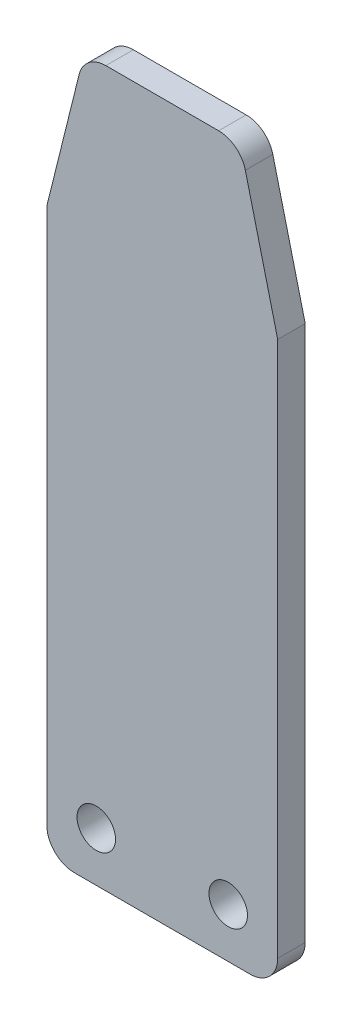
ISO-10303-21;
HEADER;
FILE_DESCRIPTION(('STEP AP214'),'2;1');
FILE_NAME('part.step','',(''),(''),'','','');
FILE_SCHEMA(('AUTOMOTIVE_DESIGN { 1 0 10303 214 1 1 1 1 }'));
ENDSEC;
DATA;
#1=APPLICATION_CONTEXT('core data for automotive mechanical design processes');
#2=APPLICATION_PROTOCOL_DEFINITION('international standard','automotive_design',2000,#1);
#3=PRODUCT_CONTEXT('',#1,'mechanical');
#4=PRODUCT('Part','Part','',(#3));
#5=PRODUCT_RELATED_PRODUCT_CATEGORY('part','',(#4));
#6=PRODUCT_DEFINITION_FORMATION('','',#4);
#7=PRODUCT_DEFINITION_CONTEXT('part definition',#1,'design');
#8=PRODUCT_DEFINITION('design','',#6,#7);
#9=PRODUCT_DEFINITION_SHAPE('','',#8);
#10=(LENGTH_UNIT() NAMED_UNIT(*) SI_UNIT(.MILLI.,.METRE.));
#11=(NAMED_UNIT(*) PLANE_ANGLE_UNIT() SI_UNIT($,.RADIAN.));
#12=(NAMED_UNIT(*) SI_UNIT($,.STERADIAN.) SOLID_ANGLE_UNIT());
#13=UNCERTAINTY_MEASURE_WITH_UNIT(LENGTH_MEASURE(1.E-05),#10,'distance_accuracy_value','');
#14=(GEOMETRIC_REPRESENTATION_CONTEXT(3) GLOBAL_UNCERTAINTY_ASSIGNED_CONTEXT((#13)) GLOBAL_UNIT_ASSIGNED_CONTEXT((#10,
#11,#12)) REPRESENTATION_CONTEXT('',''));
#15=CARTESIAN_POINT('',(0.,0.,0.));
#16=DIRECTION('',(0.,0.,1.));
#17=DIRECTION('',(1.,0.,0.));
#18=AXIS2_PLACEMENT_3D('',#15,#16,#17);
#19=CARTESIAN_POINT('',(32.,10.,10.));
#20=DIRECTION('',(0.,0.,-1.));
#21=DIRECTION('',(-1.,0.,0.));
#22=AXIS2_PLACEMENT_3D('',#19,#20,#21);
#23=PLANE('',#22);
#24=DIRECTION('',(0.,1.,0.));
#25=VECTOR('',#24,1.);
#26=CARTESIAN_POINT('',(42.,205.,10.));
#27=LINE('',#26,#25);
#28=CARTESIAN_POINT('',(42.,10.,10.));
#29=VERTEX_POINT('',#28);
#30=CARTESIAN_POINT('',(42.,205.,10.));
#31=VERTEX_POINT('',#30);
#32=EDGE_CURVE('E188',#29,#31,#27,.T.);
#33=ORIENTED_EDGE('',*,*,#32,.T.);
#34=DIRECTION('',(-0.241081408406981,0.970504896700942,0.));
#35=VECTOR('',#34,1.);
#36=CARTESIAN_POINT('',(30.2227633554835,252.41081408407,10.));
#37=LINE('',#36,#35);
#38=CARTESIAN_POINT('',(30.2227633554835,252.41081408407,10.));
#39=VERTEX_POINT('',#38);
#40=EDGE_CURVE('E112',#31,#39,#37,.T.);
#41=ORIENTED_EDGE('',*,*,#40,.T.);
#42=CARTESIAN_POINT('',(20.5177143884741,250.,10.));
#43=DIRECTION('',(0.,0.,1.));
#44=DIRECTION('',(-1.,0.,0.));
#45=AXIS2_PLACEMENT_3D('',#42,#43,#44);
#46=CIRCLE('',#45,9.99999999999998);
#47=CARTESIAN_POINT('',(20.517714388474,260.,10.));
#48=VERTEX_POINT('',#47);
#49=EDGE_CURVE('E217',#39,#48,#46,.T.);
#50=ORIENTED_EDGE('',*,*,#49,.T.);
#51=DIRECTION('',(-1.,0.,0.));
#52=VECTOR('',#51,1.);
#53=CARTESIAN_POINT('',(-20.517714388474,260.,10.));
#54=LINE('',#53,#52);
#55=CARTESIAN_POINT('',(-20.517714388474,260.,10.));
#56=VERTEX_POINT('',#55);
#57=EDGE_CURVE('E237',#48,#56,#54,.T.);
#58=ORIENTED_EDGE('',*,*,#57,.T.);
#59=CARTESIAN_POINT('',(-20.5177143884741,250.,10.));
#60=DIRECTION('',(0.,0.,1.));
#61=DIRECTION('',(1.,0.,0.));
#62=AXIS2_PLACEMENT_3D('',#59,#60,#61);
#63=CIRCLE('',#62,9.99999999999998);
#64=CARTESIAN_POINT('',(-30.2227633554835,252.41081408407,10.));
#65=VERTEX_POINT('',#64);
#66=EDGE_CURVE('E233',#56,#65,#63,.T.);
#67=ORIENTED_EDGE('',*,*,#66,.T.);
#68=DIRECTION('',(-0.241081408406981,-0.970504896700942,0.));
#69=VECTOR('',#68,1.);
#70=CARTESIAN_POINT('',(-30.2227633554835,252.41081408407,10.));
#71=LINE('',#70,#69);
#72=CARTESIAN_POINT('',(-42.,205.,10.));
#73=VERTEX_POINT('',#72);
#74=EDGE_CURVE('E236',#65,#73,#71,.T.);
#75=ORIENTED_EDGE('',*,*,#74,.T.);
#76=DIRECTION('',(0.,-1.,0.));
#77=VECTOR('',#76,1.);
#78=CARTESIAN_POINT('',(-42.,205.,10.));
#79=LINE('',#78,#77);
#80=CARTESIAN_POINT('',(-42.,10.,10.));
#81=VERTEX_POINT('',#80);
#82=EDGE_CURVE('E137',#73,#81,#79,.T.);
#83=ORIENTED_EDGE('',*,*,#82,.T.);
#84=CARTESIAN_POINT('',(-32.,10.,10.));
#85=DIRECTION('',(0.,0.,1.));
#86=DIRECTION('',(1.,0.,0.));
#87=AXIS2_PLACEMENT_3D('',#84,#85,#86);
#88=CIRCLE('',#87,10.);
#89=CARTESIAN_POINT('',(-32.,0.,10.));
#90=VERTEX_POINT('',#89);
#91=EDGE_CURVE('E131',#81,#90,#88,.T.);
#92=ORIENTED_EDGE('',*,*,#91,.T.);
#93=DIRECTION('',(1.,0.,0.));
#94=VECTOR('',#93,1.);
#95=CARTESIAN_POINT('',(32.,0.,10.));
#96=LINE('',#95,#94);
#97=CARTESIAN_POINT('',(32.,0.,10.));
#98=VERTEX_POINT('',#97);
#99=EDGE_CURVE('E135',#90,#98,#96,.T.);
#100=ORIENTED_EDGE('',*,*,#99,.T.);
#101=CARTESIAN_POINT('',(32.,10.,10.));
#102=DIRECTION('',(0.,0.,1.));
#103=DIRECTION('',(-1.,0.,0.));
#104=AXIS2_PLACEMENT_3D('',#101,#102,#103);
#105=CIRCLE('',#104,10.);
#106=EDGE_CURVE('E63',#98,#29,#105,.T.);
#107=ORIENTED_EDGE('',*,*,#106,.T.);
#108=EDGE_LOOP('',(#33,#41,#50,#58,#67,#75,#83,#92,#100,#107));
#109=FACE_BOUND('',#108,.T.);
#110=CARTESIAN_POINT('',(24.,18.,10.));
#111=DIRECTION('',(0.,0.,1.));
#112=DIRECTION('',(1.,0.,0.));
#113=AXIS2_PLACEMENT_3D('',#110,#111,#112);
#114=CIRCLE('',#113,7.);
#115=CARTESIAN_POINT('',(31.,18.,10.));
#116=VERTEX_POINT('',#115);
#117=EDGE_CURVE('E164',#116,#116,#114,.T.);
#118=ORIENTED_EDGE('',*,*,#117,.F.);
#119=EDGE_LOOP('',(#118));
#120=FACE_BOUND('',#119,.T.);
#121=CARTESIAN_POINT('',(-24.,18.,10.));
#122=DIRECTION('',(0.,0.,1.));
#123=DIRECTION('',(-1.,0.,0.));
#124=AXIS2_PLACEMENT_3D('',#121,#122,#123);
#125=CIRCLE('',#124,7.);
#126=CARTESIAN_POINT('',(-31.,18.,10.));
#127=VERTEX_POINT('',#126);
#128=EDGE_CURVE('E255',#127,#127,#125,.T.);
#129=ORIENTED_EDGE('',*,*,#128,.F.);
#130=EDGE_LOOP('',(#129));
#131=FACE_BOUND('',#130,.T.);
#132=ADVANCED_FACE('F45',(#109,#120,#131),#23,.F.);
#133=CARTESIAN_POINT('',(32.,10.,0.));
#134=DIRECTION('',(0.,0.,-1.));
#135=DIRECTION('',(-1.,0.,0.));
#136=AXIS2_PLACEMENT_3D('',#133,#134,#135);
#137=PLANE('',#136);
#138=CARTESIAN_POINT('',(24.,18.,0.));
#139=DIRECTION('',(0.,0.,1.));
#140=DIRECTION('',(1.,0.,0.));
#141=AXIS2_PLACEMENT_3D('',#138,#139,#140);
#142=CIRCLE('',#141,7.);
#143=CARTESIAN_POINT('',(31.,18.,0.));
#144=VERTEX_POINT('',#143);
#145=EDGE_CURVE('E251',#144,#144,#142,.T.);
#146=ORIENTED_EDGE('',*,*,#145,.T.);
#147=EDGE_LOOP('',(#146));
#148=FACE_BOUND('',#147,.T.);
#149=DIRECTION('',(0.,1.,0.));
#150=VECTOR('',#149,1.);
#151=CARTESIAN_POINT('',(42.,205.,0.));
#152=LINE('',#151,#150);
#153=CARTESIAN_POINT('',(42.,10.,0.));
#154=VERTEX_POINT('',#153);
#155=CARTESIAN_POINT('',(42.,205.,0.));
#156=VERTEX_POINT('',#155);
#157=EDGE_CURVE('E159',#154,#156,#152,.T.);
#158=ORIENTED_EDGE('',*,*,#157,.F.);
#159=CARTESIAN_POINT('',(32.,10.,0.));
#160=DIRECTION('',(0.,0.,1.));
#161=DIRECTION('',(-1.,0.,0.));
#162=AXIS2_PLACEMENT_3D('',#159,#160,#161);
#163=CIRCLE('',#162,10.);
#164=CARTESIAN_POINT('',(32.,0.,0.));
#165=VERTEX_POINT('',#164);
#166=EDGE_CURVE('E104',#165,#154,#163,.T.);
#167=ORIENTED_EDGE('',*,*,#166,.F.);
#168=DIRECTION('',(1.,0.,0.));
#169=VECTOR('',#168,1.);
#170=CARTESIAN_POINT('',(32.,0.,0.));
#171=LINE('',#170,#169);
#172=CARTESIAN_POINT('',(-32.,0.,0.));
#173=VERTEX_POINT('',#172);
#174=EDGE_CURVE('E98',#173,#165,#171,.T.);
#175=ORIENTED_EDGE('',*,*,#174,.F.);
#176=CARTESIAN_POINT('',(-32.,10.,0.));
#177=DIRECTION('',(0.,0.,1.));
#178=DIRECTION('',(1.,0.,0.));
#179=AXIS2_PLACEMENT_3D('',#176,#177,#178);
#180=CIRCLE('',#179,10.);
#181=CARTESIAN_POINT('',(-42.,10.,0.));
#182=VERTEX_POINT('',#181);
#183=EDGE_CURVE('E146',#182,#173,#180,.T.);
#184=ORIENTED_EDGE('',*,*,#183,.F.);
#185=DIRECTION('',(0.,-1.,0.));
#186=VECTOR('',#185,1.);
#187=CARTESIAN_POINT('',(-42.,205.,0.));
#188=LINE('',#187,#186);
#189=CARTESIAN_POINT('',(-42.,205.,0.));
#190=VERTEX_POINT('',#189);
#191=EDGE_CURVE('E179',#190,#182,#188,.T.);
#192=ORIENTED_EDGE('',*,*,#191,.F.);
#193=DIRECTION('',(-0.241081408406981,-0.970504896700942,0.));
#194=VECTOR('',#193,1.);
#195=CARTESIAN_POINT('',(-30.2227633554835,252.41081408407,0.));
#196=LINE('',#195,#194);
#197=CARTESIAN_POINT('',(-30.2227633554835,252.41081408407,0.));
#198=VERTEX_POINT('',#197);
#199=EDGE_CURVE('E176',#198,#190,#196,.T.);
#200=ORIENTED_EDGE('',*,*,#199,.F.);
#201=CARTESIAN_POINT('',(-20.5177143884741,250.,0.));
#202=DIRECTION('',(0.,0.,1.));
#203=DIRECTION('',(1.,0.,0.));
#204=AXIS2_PLACEMENT_3D('',#201,#202,#203);
#205=CIRCLE('',#204,9.99999999999998);
#206=CARTESIAN_POINT('',(-20.517714388474,260.,0.));
#207=VERTEX_POINT('',#206);
#208=EDGE_CURVE('E173',#207,#198,#205,.T.);
#209=ORIENTED_EDGE('',*,*,#208,.F.);
#210=DIRECTION('',(-1.,0.,0.));
#211=VECTOR('',#210,1.);
#212=CARTESIAN_POINT('',(-20.517714388474,260.,0.));
#213=LINE('',#212,#211);
#214=CARTESIAN_POINT('',(20.517714388474,260.,0.));
#215=VERTEX_POINT('',#214);
#216=EDGE_CURVE('E170',#215,#207,#213,.T.);
#217=ORIENTED_EDGE('',*,*,#216,.F.);
#218=CARTESIAN_POINT('',(20.5177143884741,250.,0.));
#219=DIRECTION('',(0.,0.,1.));
#220=DIRECTION('',(-1.,0.,0.));
#221=AXIS2_PLACEMENT_3D('',#218,#219,#220);
#222=CIRCLE('',#221,9.99999999999998);
#223=CARTESIAN_POINT('',(30.2227633554835,252.41081408407,0.));
#224=VERTEX_POINT('',#223);
#225=EDGE_CURVE('E167',#224,#215,#222,.T.);
#226=ORIENTED_EDGE('',*,*,#225,.F.);
#227=DIRECTION('',(-0.241081408406981,0.970504896700942,0.));
#228=VECTOR('',#227,1.);
#229=CARTESIAN_POINT('',(30.2227633554835,252.41081408407,0.));
#230=LINE('',#229,#228);
#231=EDGE_CURVE('E163',#156,#224,#230,.T.);
#232=ORIENTED_EDGE('',*,*,#231,.F.);
#233=EDGE_LOOP('',(#158,#167,#175,#184,#192,#200,#209,#217,#226,#232));
#234=FACE_BOUND('',#233,.T.);
#235=CARTESIAN_POINT('',(-24.,18.,0.));
#236=DIRECTION('',(0.,0.,1.));
#237=DIRECTION('',(-1.,0.,0.));
#238=AXIS2_PLACEMENT_3D('',#235,#236,#237);
#239=CIRCLE('',#238,7.);
#240=CARTESIAN_POINT('',(-31.,18.,0.));
#241=VERTEX_POINT('',#240);
#242=EDGE_CURVE('E259',#241,#241,#239,.T.);
#243=ORIENTED_EDGE('',*,*,#242,.T.);
#244=EDGE_LOOP('',(#243));
#245=FACE_BOUND('',#244,.T.);
#246=ADVANCED_FACE('F221',(#148,#234,#245),#137,.T.);
#247=CARTESIAN_POINT('',(42.,205.,10.));
#248=DIRECTION('',(-1.,0.,0.));
#249=DIRECTION('',(0.,-1.,0.));
#250=AXIS2_PLACEMENT_3D('',#247,#248,#249);
#251=PLANE('',#250);
#252=ORIENTED_EDGE('',*,*,#157,.T.);
#253=DIRECTION('',(0.,0.,-1.));
#254=VECTOR('',#253,1.);
#255=CARTESIAN_POINT('',(42.,205.,10.));
#256=LINE('',#255,#254);
#257=EDGE_CURVE('E11',#31,#156,#256,.T.);
#258=ORIENTED_EDGE('',*,*,#257,.F.);
#259=ORIENTED_EDGE('',*,*,#32,.F.);
#260=DIRECTION('',(0.,0.,-1.));
#261=VECTOR('',#260,1.);
#262=CARTESIAN_POINT('',(42.,10.,10.));
#263=LINE('',#262,#261);
#264=EDGE_CURVE('E155',#29,#154,#263,.T.);
#265=ORIENTED_EDGE('',*,*,#264,.T.);
#266=EDGE_LOOP('',(#252,#258,#259,#265));
#267=FACE_BOUND('',#266,.T.);
#268=ADVANCED_FACE('F47',(#267),#251,.F.);
#269=CARTESIAN_POINT('',(30.2227633554835,252.41081408407,10.));
#270=DIRECTION('',(-0.970504896700942,-0.241081408406981,0.));
#271=DIRECTION('',(0.241081408406981,-0.970504896700942,0.));
#272=AXIS2_PLACEMENT_3D('',#269,#270,#271);
#273=PLANE('',#272);
#274=ORIENTED_EDGE('',*,*,#231,.T.);
#275=DIRECTION('',(0.,0.,-1.));
#276=VECTOR('',#275,1.);
#277=CARTESIAN_POINT('',(30.2227633554835,252.41081408407,10.));
#278=LINE('',#277,#276);
#279=EDGE_CURVE('E55',#39,#224,#278,.T.);
#280=ORIENTED_EDGE('',*,*,#279,.F.);
#281=ORIENTED_EDGE('',*,*,#40,.F.);
#282=ORIENTED_EDGE('',*,*,#257,.T.);
#283=EDGE_LOOP('',(#274,#280,#281,#282));
#284=FACE_BOUND('',#283,.T.);
#285=ADVANCED_FACE('F301',(#284),#273,.F.);
#286=CARTESIAN_POINT('',(20.5177143884741,250.,10.));
#287=DIRECTION('',(0.,0.,-1.));
#288=DIRECTION('',(-1.,0.,0.));
#289=AXIS2_PLACEMENT_3D('',#286,#287,#288);
#290=CYLINDRICAL_SURFACE('',#289,9.99999999999998);
#291=ORIENTED_EDGE('',*,*,#225,.T.);
#292=DIRECTION('',(0.,0.,-1.));
#293=VECTOR('',#292,1.);
#294=CARTESIAN_POINT('',(20.517714388474,260.,10.));
#295=LINE('',#294,#293);
#296=EDGE_CURVE('E207',#48,#215,#295,.T.);
#297=ORIENTED_EDGE('',*,*,#296,.F.);
#298=ORIENTED_EDGE('',*,*,#49,.F.);
#299=ORIENTED_EDGE('',*,*,#279,.T.);
#300=EDGE_LOOP('',(#291,#297,#298,#299));
#301=FACE_BOUND('',#300,.T.);
#302=ADVANCED_FACE('F215',(#301),#290,.T.);
#303=CARTESIAN_POINT('',(-20.517714388474,260.,10.));
#304=DIRECTION('',(0.,-1.,0.));
#305=DIRECTION('',(0.,0.,-1.));
#306=AXIS2_PLACEMENT_3D('',#303,#304,#305);
#307=PLANE('',#306);
#308=ORIENTED_EDGE('',*,*,#216,.T.);
#309=DIRECTION('',(0.,0.,-1.));
#310=VECTOR('',#309,1.);
#311=CARTESIAN_POINT('',(-20.517714388474,260.,10.));
#312=LINE('',#311,#310);
#313=EDGE_CURVE('E203',#56,#207,#312,.T.);
#314=ORIENTED_EDGE('',*,*,#313,.F.);
#315=ORIENTED_EDGE('',*,*,#57,.F.);
#316=ORIENTED_EDGE('',*,*,#296,.T.);
#317=EDGE_LOOP('',(#308,#314,#315,#316));
#318=FACE_BOUND('',#317,.T.);
#319=ADVANCED_FACE('F227',(#318),#307,.F.);
#320=CARTESIAN_POINT('',(-20.5177143884741,250.,10.));
#321=DIRECTION('',(0.,0.,-1.));
#322=DIRECTION('',(-1.,0.,0.));
#323=AXIS2_PLACEMENT_3D('',#320,#321,#322);
#324=CYLINDRICAL_SURFACE('',#323,9.99999999999998);
#325=ORIENTED_EDGE('',*,*,#208,.T.);
#326=DIRECTION('',(0.,0.,-1.));
#327=VECTOR('',#326,1.);
#328=CARTESIAN_POINT('',(-30.2227633554835,252.41081408407,10.));
#329=LINE('',#328,#327);
#330=EDGE_CURVE('E199',#65,#198,#329,.T.);
#331=ORIENTED_EDGE('',*,*,#330,.F.);
#332=ORIENTED_EDGE('',*,*,#66,.F.);
#333=ORIENTED_EDGE('',*,*,#313,.T.);
#334=EDGE_LOOP('',(#325,#331,#332,#333));
#335=FACE_BOUND('',#334,.T.);
#336=ADVANCED_FACE('F231',(#335),#324,.T.);
#337=CARTESIAN_POINT('',(-30.2227633554835,252.41081408407,10.));
#338=DIRECTION('',(0.970504896700942,-0.241081408406981,0.));
#339=DIRECTION('',(0.241081408406981,0.970504896700942,0.));
#340=AXIS2_PLACEMENT_3D('',#337,#338,#339);
#341=PLANE('',#340);
#342=ORIENTED_EDGE('',*,*,#199,.T.);
#343=DIRECTION('',(0.,0.,-1.));
#344=VECTOR('',#343,1.);
#345=CARTESIAN_POINT('',(-42.,205.,10.));
#346=LINE('',#345,#344);
#347=EDGE_CURVE('E195',#73,#190,#346,.T.);
#348=ORIENTED_EDGE('',*,*,#347,.F.);
#349=ORIENTED_EDGE('',*,*,#74,.F.);
#350=ORIENTED_EDGE('',*,*,#330,.T.);
#351=EDGE_LOOP('',(#342,#348,#349,#350));
#352=FACE_BOUND('',#351,.T.);
#353=ADVANCED_FACE('F291',(#352),#341,.F.);
#354=CARTESIAN_POINT('',(-42.,205.,10.));
#355=DIRECTION('',(1.,0.,0.));
#356=DIRECTION('',(0.,1.,0.));
#357=AXIS2_PLACEMENT_3D('',#354,#355,#356);
#358=PLANE('',#357);
#359=ORIENTED_EDGE('',*,*,#191,.T.);
#360=DIRECTION('',(0.,0.,-1.));
#361=VECTOR('',#360,1.);
#362=CARTESIAN_POINT('',(-42.,10.,10.));
#363=LINE('',#362,#361);
#364=EDGE_CURVE('E148',#81,#182,#363,.T.);
#365=ORIENTED_EDGE('',*,*,#364,.F.);
#366=ORIENTED_EDGE('',*,*,#82,.F.);
#367=ORIENTED_EDGE('',*,*,#347,.T.);
#368=EDGE_LOOP('',(#359,#365,#366,#367));
#369=FACE_BOUND('',#368,.T.);
#370=ADVANCED_FACE('F288',(#369),#358,.F.);
#371=CARTESIAN_POINT('',(-32.,10.,10.));
#372=DIRECTION('',(0.,0.,-1.));
#373=DIRECTION('',(-1.,0.,0.));
#374=AXIS2_PLACEMENT_3D('',#371,#372,#373);
#375=CYLINDRICAL_SURFACE('',#374,10.);
#376=ORIENTED_EDGE('',*,*,#183,.T.);
#377=DIRECTION('',(0.,0.,-1.));
#378=VECTOR('',#377,1.);
#379=CARTESIAN_POINT('',(-32.,0.,10.));
#380=LINE('',#379,#378);
#381=EDGE_CURVE('E143',#90,#173,#380,.T.);
#382=ORIENTED_EDGE('',*,*,#381,.F.);
#383=ORIENTED_EDGE('',*,*,#91,.F.);
#384=ORIENTED_EDGE('',*,*,#364,.T.);
#385=EDGE_LOOP('',(#376,#382,#383,#384));
#386=FACE_BOUND('',#385,.T.);
#387=ADVANCED_FACE('F144',(#386),#375,.T.);
#388=CARTESIAN_POINT('',(32.,0.,10.));
#389=DIRECTION('',(0.,1.,0.));
#390=DIRECTION('',(-1.,0.,0.));
#391=AXIS2_PLACEMENT_3D('',#388,#389,#390);
#392=PLANE('',#391);
#393=ORIENTED_EDGE('',*,*,#174,.T.);
#394=DIRECTION('',(0.,0.,-1.));
#395=VECTOR('',#394,1.);
#396=CARTESIAN_POINT('',(32.,0.,10.));
#397=LINE('',#396,#395);
#398=EDGE_CURVE('E149',#98,#165,#397,.T.);
#399=ORIENTED_EDGE('',*,*,#398,.F.);
#400=ORIENTED_EDGE('',*,*,#99,.F.);
#401=ORIENTED_EDGE('',*,*,#381,.T.);
#402=EDGE_LOOP('',(#393,#399,#400,#401));
#403=FACE_BOUND('',#402,.T.);
#404=ADVANCED_FACE('F151',(#403),#392,.F.);
#405=CARTESIAN_POINT('',(32.,10.,10.));
#406=DIRECTION('',(0.,0.,-1.));
#407=DIRECTION('',(-1.,0.,0.));
#408=AXIS2_PLACEMENT_3D('',#405,#406,#407);
#409=CYLINDRICAL_SURFACE('',#408,10.);
#410=ORIENTED_EDGE('',*,*,#166,.T.);
#411=ORIENTED_EDGE('',*,*,#264,.F.);
#412=ORIENTED_EDGE('',*,*,#106,.F.);
#413=ORIENTED_EDGE('',*,*,#398,.T.);
#414=EDGE_LOOP('',(#410,#411,#412,#413));
#415=FACE_BOUND('',#414,.T.);
#416=ADVANCED_FACE('F281',(#415),#409,.T.);
#417=CARTESIAN_POINT('',(24.,18.,10.));
#418=DIRECTION('',(0.,0.,-1.));
#419=DIRECTION('',(-1.,0.,0.));
#420=AXIS2_PLACEMENT_3D('',#417,#418,#419);
#421=CYLINDRICAL_SURFACE('',#420,7.);
#422=ORIENTED_EDGE('',*,*,#117,.T.);
#423=EDGE_LOOP('',(#422));
#424=FACE_BOUND('',#423,.T.);
#425=ORIENTED_EDGE('',*,*,#145,.F.);
#426=EDGE_LOOP('',(#425));
#427=FACE_BOUND('',#426,.T.);
#428=ADVANCED_FACE('F278',(#424,#427),#421,.F.);
#429=CARTESIAN_POINT('',(-24.,18.,10.));
#430=DIRECTION('',(0.,0.,-1.));
#431=DIRECTION('',(-1.,0.,0.));
#432=AXIS2_PLACEMENT_3D('',#429,#430,#431);
#433=CYLINDRICAL_SURFACE('',#432,7.);
#434=ORIENTED_EDGE('',*,*,#128,.T.);
#435=EDGE_LOOP('',(#434));
#436=FACE_BOUND('',#435,.T.);
#437=ORIENTED_EDGE('',*,*,#242,.F.);
#438=EDGE_LOOP('',(#437));
#439=FACE_BOUND('',#438,.T.);
#440=ADVANCED_FACE('F267',(#436,#439),#433,.F.);
#441=CLOSED_SHELL('',(#132,#246,#268,#285,#302,#319,#336,#353,#370,#387,#404,#416,#428,#440));
#442=MANIFOLD_SOLID_BREP('B2',#441);
#443=ADVANCED_BREP_SHAPE_REPRESENTATION('',(#18,#442),#14);
#444=SHAPE_DEFINITION_REPRESENTATION(#9,#443);
ENDSEC;
END-ISO-10303-21;
